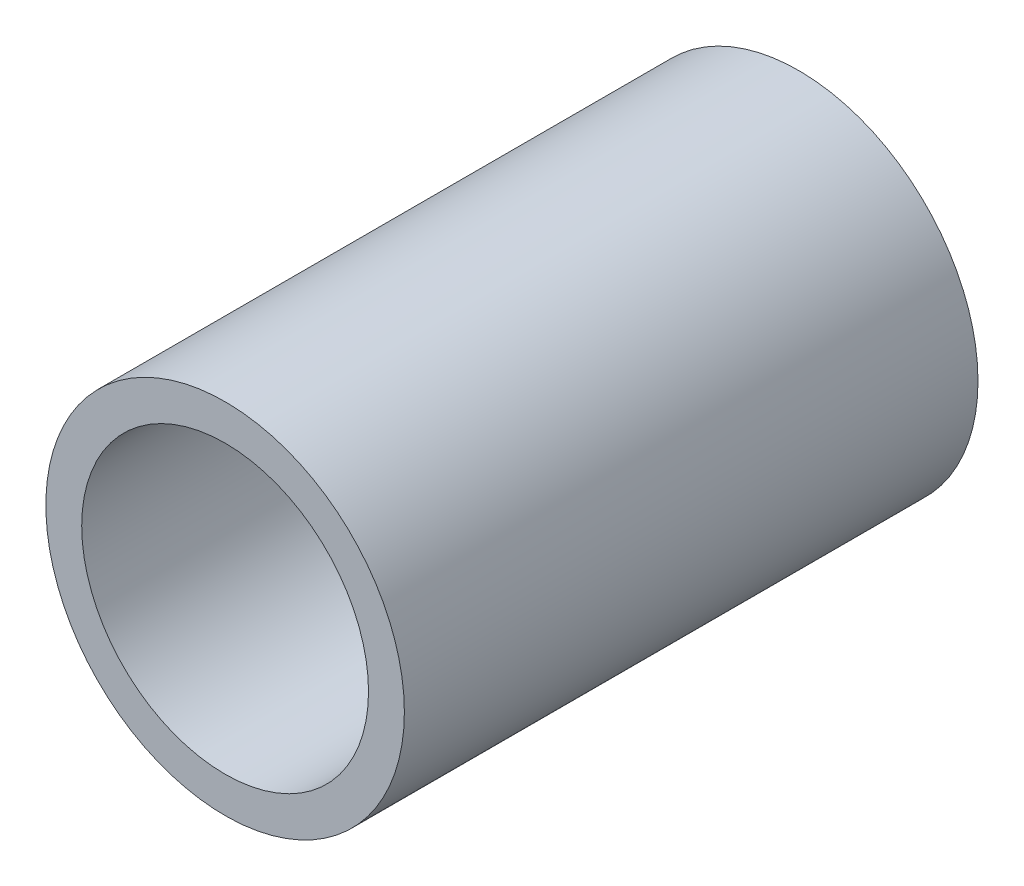
ISO-10303-21;
HEADER;
FILE_DESCRIPTION(('STEP AP214'),'2;1');
FILE_NAME('part.step','',(''),(''),'','','');
FILE_SCHEMA(('AUTOMOTIVE_DESIGN { 1 0 10303 214 1 1 1 1 }'));
ENDSEC;
DATA;
#1=APPLICATION_CONTEXT('core data for automotive mechanical design processes');
#2=APPLICATION_PROTOCOL_DEFINITION('international standard','automotive_design',2000,#1);
#3=PRODUCT_CONTEXT('',#1,'mechanical');
#4=PRODUCT('Part','Part','',(#3));
#5=PRODUCT_RELATED_PRODUCT_CATEGORY('part','',(#4));
#6=PRODUCT_DEFINITION_FORMATION('','',#4);
#7=PRODUCT_DEFINITION_CONTEXT('part definition',#1,'design');
#8=PRODUCT_DEFINITION('design','',#6,#7);
#9=PRODUCT_DEFINITION_SHAPE('','',#8);
#10=(LENGTH_UNIT() NAMED_UNIT(*) SI_UNIT(.MILLI.,.METRE.));
#11=(NAMED_UNIT(*) PLANE_ANGLE_UNIT() SI_UNIT($,.RADIAN.));
#12=(NAMED_UNIT(*) SI_UNIT($,.STERADIAN.) SOLID_ANGLE_UNIT());
#13=UNCERTAINTY_MEASURE_WITH_UNIT(LENGTH_MEASURE(1.E-05),#10,'distance_accuracy_value','');
#14=(GEOMETRIC_REPRESENTATION_CONTEXT(3) GLOBAL_UNCERTAINTY_ASSIGNED_CONTEXT((#13)) GLOBAL_UNIT_ASSIGNED_CONTEXT((#10,
#11,#12)) REPRESENTATION_CONTEXT('',''));
#15=CARTESIAN_POINT('',(0.,0.,0.));
#16=DIRECTION('',(0.,0.,1.));
#17=DIRECTION('',(1.,0.,0.));
#18=AXIS2_PLACEMENT_3D('',#15,#16,#17);
#19=CARTESIAN_POINT('',(0.,0.,40.));
#20=DIRECTION('',(0.,0.,1.));
#21=DIRECTION('',(1.,0.,0.));
#22=AXIS2_PLACEMENT_3D('',#19,#20,#21);
#23=PLANE('',#22);
#24=CARTESIAN_POINT('',(0.,0.,40.));
#25=DIRECTION('',(0.,0.,1.));
#26=DIRECTION('',(1.,0.,0.));
#27=AXIS2_PLACEMENT_3D('',#24,#25,#26);
#28=CIRCLE('',#27,12.5);
#29=CARTESIAN_POINT('',(12.5,0.,40.));
#30=VERTEX_POINT('',#29);
#31=EDGE_CURVE('E10',#30,#30,#28,.T.);
#32=ORIENTED_EDGE('',*,*,#31,.T.);
#33=EDGE_LOOP('',(#32));
#34=FACE_BOUND('',#33,.T.);
#35=CARTESIAN_POINT('',(0.,0.,40.));
#36=DIRECTION('',(0.,0.,1.));
#37=DIRECTION('',(1.,0.,0.));
#38=AXIS2_PLACEMENT_3D('',#35,#36,#37);
#39=CIRCLE('',#38,10.);
#40=CARTESIAN_POINT('',(10.,0.,40.));
#41=VERTEX_POINT('',#40);
#42=EDGE_CURVE('E42',#41,#41,#39,.T.);
#43=ORIENTED_EDGE('',*,*,#42,.F.);
#44=EDGE_LOOP('',(#43));
#45=FACE_BOUND('',#44,.T.);
#46=ADVANCED_FACE('F31',(#34,#45),#23,.T.);
#47=CARTESIAN_POINT('',(0.,0.,0.));
#48=DIRECTION('',(0.,0.,1.));
#49=DIRECTION('',(1.,0.,0.));
#50=AXIS2_PLACEMENT_3D('',#47,#48,#49);
#51=PLANE('',#50);
#52=CARTESIAN_POINT('',(0.,0.,0.));
#53=DIRECTION('',(0.,0.,1.));
#54=DIRECTION('',(1.,0.,0.));
#55=AXIS2_PLACEMENT_3D('',#52,#53,#54);
#56=CIRCLE('',#55,12.5);
#57=CARTESIAN_POINT('',(12.5,0.,0.));
#58=VERTEX_POINT('',#57);
#59=EDGE_CURVE('E35',#58,#58,#56,.T.);
#60=ORIENTED_EDGE('',*,*,#59,.F.);
#61=EDGE_LOOP('',(#60));
#62=FACE_BOUND('',#61,.T.);
#63=CARTESIAN_POINT('',(0.,0.,0.));
#64=DIRECTION('',(0.,0.,1.));
#65=DIRECTION('',(1.,0.,0.));
#66=AXIS2_PLACEMENT_3D('',#63,#64,#65);
#67=CIRCLE('',#66,10.);
#68=CARTESIAN_POINT('',(10.,0.,0.));
#69=VERTEX_POINT('',#68);
#70=EDGE_CURVE('E44',#69,#69,#67,.T.);
#71=ORIENTED_EDGE('',*,*,#70,.T.);
#72=EDGE_LOOP('',(#71));
#73=FACE_BOUND('',#72,.T.);
#74=ADVANCED_FACE('F54',(#62,#73),#51,.F.);
#75=CARTESIAN_POINT('',(0.,0.,40.));
#76=DIRECTION('',(0.,0.,-1.));
#77=DIRECTION('',(-1.,0.,0.));
#78=AXIS2_PLACEMENT_3D('',#75,#76,#77);
#79=CYLINDRICAL_SURFACE('',#78,12.5);
#80=ORIENTED_EDGE('',*,*,#31,.F.);
#81=EDGE_LOOP('',(#80));
#82=FACE_BOUND('',#81,.T.);
#83=ORIENTED_EDGE('',*,*,#59,.T.);
#84=EDGE_LOOP('',(#83));
#85=FACE_BOUND('',#84,.T.);
#86=ADVANCED_FACE('F33',(#82,#85),#79,.T.);
#87=CARTESIAN_POINT('',(0.,0.,40.));
#88=DIRECTION('',(0.,0.,-1.));
#89=DIRECTION('',(-1.,0.,0.));
#90=AXIS2_PLACEMENT_3D('',#87,#88,#89);
#91=CYLINDRICAL_SURFACE('',#90,10.);
#92=ORIENTED_EDGE('',*,*,#42,.T.);
#93=EDGE_LOOP('',(#92));
#94=FACE_BOUND('',#93,.T.);
#95=ORIENTED_EDGE('',*,*,#70,.F.);
#96=EDGE_LOOP('',(#95));
#97=FACE_BOUND('',#96,.T.);
#98=ADVANCED_FACE('F50',(#94,#97),#91,.F.);
#99=CLOSED_SHELL('',(#46,#74,#86,#98));
#100=MANIFOLD_SOLID_BREP('B2',#99);
#101=ADVANCED_BREP_SHAPE_REPRESENTATION('',(#18,#100),#14);
#102=SHAPE_DEFINITION_REPRESENTATION(#9,#101);
ENDSEC;
END-ISO-10303-21;
